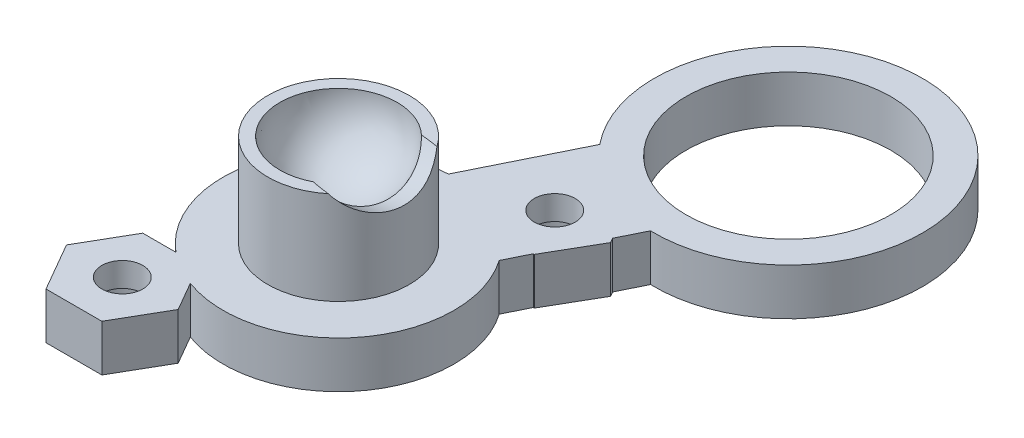
ISO-10303-21;
HEADER;
FILE_DESCRIPTION(('STEP AP214'),'2;1');
FILE_NAME('part.step','',(''),(''),'','','');
FILE_SCHEMA(('AUTOMOTIVE_DESIGN { 1 0 10303 214 1 1 1 1 }'));
ENDSEC;
DATA;
#1=APPLICATION_CONTEXT('core data for automotive mechanical design processes');
#2=APPLICATION_PROTOCOL_DEFINITION('international standard','automotive_design',2000,#1);
#3=PRODUCT_CONTEXT('',#1,'mechanical');
#4=PRODUCT('Part','Part','',(#3));
#5=PRODUCT_RELATED_PRODUCT_CATEGORY('part','',(#4));
#6=PRODUCT_DEFINITION_FORMATION('','',#4);
#7=PRODUCT_DEFINITION_CONTEXT('part definition',#1,'design');
#8=PRODUCT_DEFINITION('design','',#6,#7);
#9=PRODUCT_DEFINITION_SHAPE('','',#8);
#10=(LENGTH_UNIT() NAMED_UNIT(*) SI_UNIT(.MILLI.,.METRE.));
#11=(NAMED_UNIT(*) PLANE_ANGLE_UNIT() SI_UNIT($,.RADIAN.));
#12=(NAMED_UNIT(*) SI_UNIT($,.STERADIAN.) SOLID_ANGLE_UNIT());
#13=UNCERTAINTY_MEASURE_WITH_UNIT(LENGTH_MEASURE(1.E-05),#10,'distance_accuracy_value','');
#14=(GEOMETRIC_REPRESENTATION_CONTEXT(3) GLOBAL_UNCERTAINTY_ASSIGNED_CONTEXT((#13)) GLOBAL_UNIT_ASSIGNED_CONTEXT((#10,
#11,#12)) REPRESENTATION_CONTEXT('',''));
#15=CARTESIAN_POINT('',(0.,0.,0.));
#16=DIRECTION('',(0.,0.,1.));
#17=DIRECTION('',(1.,0.,0.));
#18=AXIS2_PLACEMENT_3D('',#15,#16,#17);
#19=CARTESIAN_POINT('',(-78.0224133595217,-108.75,-22.3612159321677));
#20=DIRECTION('',(0.,1.,0.));
#21=DIRECTION('',(0.,0.,1.));
#22=AXIS2_PLACEMENT_3D('',#19,#20,#21);
#23=CYLINDRICAL_SURFACE('',#22,1.1);
#24=CARTESIAN_POINT('',(-78.0224133595217,-106.,-22.3612159321677));
#25=DIRECTION('',(0.,-1.,0.));
#26=DIRECTION('',(0.,0.,-1.));
#27=AXIS2_PLACEMENT_3D('',#24,#25,#26);
#28=CIRCLE('',#27,1.1);
#29=CARTESIAN_POINT('',(-78.0224133595217,-106.,-23.4612159321677));
#30=VERTEX_POINT('',#29);
#31=EDGE_CURVE('E203',#30,#30,#28,.F.);
#32=ORIENTED_EDGE('',*,*,#31,.T.);
#33=EDGE_LOOP('',(#32));
#34=FACE_BOUND('',#33,.T.);
#35=CARTESIAN_POINT('',(-78.0224133595217,-107.3,-22.3612159321677));
#36=DIRECTION('',(0.,-1.,0.));
#37=DIRECTION('',(0.,0.,-1.));
#38=AXIS2_PLACEMENT_3D('',#35,#36,#37);
#39=CIRCLE('',#38,1.1);
#40=CARTESIAN_POINT('',(-78.0224133595217,-107.3,-23.4612159321677));
#41=VERTEX_POINT('',#40);
#42=EDGE_CURVE('E210',#41,#41,#39,.T.);
#43=ORIENTED_EDGE('',*,*,#42,.T.);
#44=EDGE_LOOP('',(#43));
#45=FACE_BOUND('',#44,.T.);
#46=ADVANCED_FACE('F41',(#34,#45),#23,.F.);
#47=CARTESIAN_POINT('',(-86.5224133595217,-108.75,-7.63878406783227));
#48=DIRECTION('',(0.,1.,0.));
#49=DIRECTION('',(0.,0.,1.));
#50=AXIS2_PLACEMENT_3D('',#47,#48,#49);
#51=CYLINDRICAL_SURFACE('',#50,1.1);
#52=CARTESIAN_POINT('',(-86.5224133595217,-106.,-7.63878406783227));
#53=DIRECTION('',(0.,-1.,0.));
#54=DIRECTION('',(0.,0.,-1.));
#55=AXIS2_PLACEMENT_3D('',#52,#53,#54);
#56=CIRCLE('',#55,1.1);
#57=CARTESIAN_POINT('',(-86.5224133595217,-106.,-8.73878406783227));
#58=VERTEX_POINT('',#57);
#59=EDGE_CURVE('E195',#58,#58,#56,.F.);
#60=ORIENTED_EDGE('',*,*,#59,.T.);
#61=EDGE_LOOP('',(#60));
#62=FACE_BOUND('',#61,.T.);
#63=CARTESIAN_POINT('',(-86.5224133595217,-107.3,-7.63878406783227));
#64=DIRECTION('',(0.,-1.,0.));
#65=DIRECTION('',(0.,0.,-1.));
#66=AXIS2_PLACEMENT_3D('',#63,#64,#65);
#67=CIRCLE('',#66,1.1);
#68=CARTESIAN_POINT('',(-86.5224133595217,-107.3,-8.73878406783227));
#69=VERTEX_POINT('',#68);
#70=EDGE_CURVE('E200',#69,#69,#67,.T.);
#71=ORIENTED_EDGE('',*,*,#70,.T.);
#72=EDGE_LOOP('',(#71));
#73=FACE_BOUND('',#72,.T.);
#74=ADVANCED_FACE('F348',(#62,#73),#51,.F.);
#75=CARTESIAN_POINT('',(-71.6012435520018,-108.5,-29.8496216370886));
#76=DIRECTION('',(-0.89680256466223,0.,-0.442430966383737));
#77=DIRECTION('',(-0.442430966383737,0.,0.89680256466223));
#78=AXIS2_PLACEMENT_3D('',#75,#76,#77);
#79=PLANE('',#78);
#80=DIRECTION('',(0.,1.,0.));
#81=VECTOR('',#80,1.);
#82=CARTESIAN_POINT('',(-74.49705477773,-108.5,-23.9798450361482));
#83=LINE('',#82,#81);
#84=CARTESIAN_POINT('',(-74.49705477773,-106.,-23.9798450361482));
#85=VERTEX_POINT('',#84);
#86=CARTESIAN_POINT('',(-74.49705477773,-108.5,-23.9798450361482));
#87=VERTEX_POINT('',#86);
#88=EDGE_CURVE('E241',#85,#87,#83,.F.);
#89=ORIENTED_EDGE('',*,*,#88,.F.);
#90=DIRECTION('',(-0.442430966383737,0.,0.89680256466223));
#91=VECTOR('',#90,1.);
#92=CARTESIAN_POINT('',(-71.6012435520018,-106.,-29.8496216370886));
#93=LINE('',#92,#91);
#94=CARTESIAN_POINT('',(-75.1697204578679,-106.,-22.6163593108189));
#95=VERTEX_POINT('',#94);
#96=EDGE_CURVE('E249',#85,#95,#93,.T.);
#97=ORIENTED_EDGE('',*,*,#96,.T.);
#98=DIRECTION('',(0.,-1.,0.));
#99=VECTOR('',#98,1.);
#100=CARTESIAN_POINT('',(-75.1697204578679,-108.5,-22.6163593108189));
#101=LINE('',#100,#99);
#102=CARTESIAN_POINT('',(-75.1697204578679,-108.5,-22.6163593108189));
#103=VERTEX_POINT('',#102);
#104=EDGE_CURVE('E184',#95,#103,#101,.T.);
#105=ORIENTED_EDGE('',*,*,#104,.T.);
#106=DIRECTION('',(-0.442430966383737,0.,0.89680256466223));
#107=VECTOR('',#106,1.);
#108=CARTESIAN_POINT('',(-71.6012435520018,-108.5,-29.8496216370886));
#109=LINE('',#108,#107);
#110=EDGE_CURVE('E63',#87,#103,#109,.T.);
#111=ORIENTED_EDGE('',*,*,#110,.F.);
#112=EDGE_LOOP('',(#89,#97,#105,#111));
#113=FACE_BOUND('',#112,.T.);
#114=ADVANCED_FACE('F354',(#113),#79,.F.);
#115=CARTESIAN_POINT('',(-84.9628210535084,-108.5,-16.3272928991512));
#116=DIRECTION('',(0.89680256466223,0.,0.442430966383737));
#117=DIRECTION('',(0.442430966383737,0.,-0.89680256466223));
#118=AXIS2_PLACEMENT_3D('',#115,#116,#117);
#119=PLANE('',#118);
#120=DIRECTION('',(0.,1.,0.));
#121=VECTOR('',#120,1.);
#122=CARTESIAN_POINT('',(-79.8778701657034,-108.5,-26.6344308344506));
#123=LINE('',#122,#121);
#124=CARTESIAN_POINT('',(-79.8778701657034,-108.5,-26.6344308344506));
#125=VERTEX_POINT('',#124);
#126=CARTESIAN_POINT('',(-79.8778701657034,-106.,-26.6344308344506));
#127=VERTEX_POINT('',#126);
#128=EDGE_CURVE('E49',#125,#127,#123,.T.);
#129=ORIENTED_EDGE('',*,*,#128,.F.);
#130=DIRECTION('',(0.442430966383737,0.,-0.89680256466223));
#131=VECTOR('',#130,1.);
#132=CARTESIAN_POINT('',(-84.9628210535084,-108.5,-16.3272928991512));
#133=LINE('',#132,#131);
#134=CARTESIAN_POINT('',(-82.5622508064944,-108.5,-21.193221637753));
#135=VERTEX_POINT('',#134);
#136=EDGE_CURVE('E246',#135,#125,#133,.T.);
#137=ORIENTED_EDGE('',*,*,#136,.F.);
#138=DIRECTION('',(0.,1.,0.));
#139=VECTOR('',#138,1.);
#140=CARTESIAN_POINT('',(-82.5622508064944,-108.5,-21.193221637753));
#141=LINE('',#140,#139);
#142=CARTESIAN_POINT('',(-82.5622508064944,-106.,-21.193221637753));
#143=VERTEX_POINT('',#142);
#144=EDGE_CURVE('E172',#135,#143,#141,.T.);
#145=ORIENTED_EDGE('',*,*,#144,.T.);
#146=DIRECTION('',(0.442430966383737,0.,-0.89680256466223));
#147=VECTOR('',#146,1.);
#148=CARTESIAN_POINT('',(-84.9628210535084,-106.,-16.3272928991512));
#149=LINE('',#148,#147);
#150=EDGE_CURVE('E244',#143,#127,#149,.T.);
#151=ORIENTED_EDGE('',*,*,#150,.T.);
#152=EDGE_LOOP('',(#129,#137,#145,#151));
#153=FACE_BOUND('',#152,.T.);
#154=ADVANCED_FACE('F378',(#153),#119,.F.);
#155=CARTESIAN_POINT('',(-82.2724133595217,-108.5,-15.));
#156=DIRECTION('',(0.,1.,0.));
#157=DIRECTION('',(0.,0.,1.));
#158=AXIS2_PLACEMENT_3D('',#155,#156,#157);
#159=CYLINDRICAL_SURFACE('',#158,6.2);
#160=DIRECTION('',(0.,1.,0.));
#161=VECTOR('',#160,1.);
#162=CARTESIAN_POINT('',(-77.181435418521,-108.5,-18.5386358394506));
#163=LINE('',#162,#161);
#164=CARTESIAN_POINT('',(-77.181435418521,-106.,-18.5386358394506));
#165=VERTEX_POINT('',#164);
#166=CARTESIAN_POINT('',(-77.181435418521,-108.5,-18.5386358394506));
#167=VERTEX_POINT('',#166);
#168=EDGE_CURVE('E177',#165,#167,#163,.F.);
#169=ORIENTED_EDGE('',*,*,#168,.F.);
#170=CARTESIAN_POINT('',(-82.2724133595217,-106.,-15.));
#171=DIRECTION('',(0.,-1.,0.));
#172=DIRECTION('',(0.,0.,-1.));
#173=AXIS2_PLACEMENT_3D('',#170,#171,#172);
#174=CIRCLE('',#173,6.2);
#175=CARTESIAN_POINT('',(-84.4129423972751,-106.,-9.18122560683656));
#176=VERTEX_POINT('',#175);
#177=EDGE_CURVE('E325',#165,#176,#174,.T.);
#178=ORIENTED_EDGE('',*,*,#177,.T.);
#179=DIRECTION('',(0.,1.,0.));
#180=VECTOR('',#179,1.);
#181=CARTESIAN_POINT('',(-84.4129423972751,-108.5,-9.18122560683656));
#182=LINE('',#181,#180);
#183=CARTESIAN_POINT('',(-84.4129423972751,-108.5,-9.18122560683656));
#184=VERTEX_POINT('',#183);
#185=EDGE_CURVE('E318',#184,#176,#182,.T.);
#186=ORIENTED_EDGE('',*,*,#185,.F.);
#187=CARTESIAN_POINT('',(-82.2724133595217,-108.5,-15.));
#188=DIRECTION('',(0.,-1.,0.));
#189=DIRECTION('',(0.,0.,-1.));
#190=AXIS2_PLACEMENT_3D('',#187,#188,#189);
#191=CIRCLE('',#190,6.2);
#192=EDGE_CURVE('E330',#167,#184,#191,.T.);
#193=ORIENTED_EDGE('',*,*,#192,.F.);
#194=EDGE_LOOP('',(#169,#178,#186,#193));
#195=FACE_BOUND('',#194,.T.);
#196=ADVANCED_FACE('F385',(#195),#159,.T.);
#197=ORIENTED_EDGE('',*,*,#144,.F.);
#198=CARTESIAN_POINT('',(-86.2413552840149,-108.5,-10.2368602791856));
#199=VERTEX_POINT('',#198);
#200=EDGE_CURVE('E323',#199,#135,#191,.T.);
#201=ORIENTED_EDGE('',*,*,#200,.F.);
#202=DIRECTION('',(0.,1.,0.));
#203=VECTOR('',#202,1.);
#204=CARTESIAN_POINT('',(-86.2413552840149,-108.5,-10.2368602791856));
#205=LINE('',#204,#203);
#206=CARTESIAN_POINT('',(-86.2413552840149,-106.,-10.2368602791856));
#207=VERTEX_POINT('',#206);
#208=EDGE_CURVE('E320',#207,#199,#205,.F.);
#209=ORIENTED_EDGE('',*,*,#208,.F.);
#210=EDGE_CURVE('E326',#207,#143,#174,.T.);
#211=ORIENTED_EDGE('',*,*,#210,.T.);
#212=EDGE_LOOP('',(#197,#201,#209,#211));
#213=FACE_BOUND('',#212,.T.);
#214=ADVANCED_FACE('F388',(#213),#159,.T.);
#215=CARTESIAN_POINT('',(-76.5224133595217,-108.5,-19.7631397208144));
#216=DIRECTION('',(0.,0.,-1.));
#217=DIRECTION('',(-1.,0.,0.));
#218=AXIS2_PLACEMENT_3D('',#215,#216,#217);
#219=PLANE('',#218);
#220=DIRECTION('',(0.,1.,0.));
#221=VECTOR('',#220,1.);
#222=CARTESIAN_POINT('',(-76.5773354115407,-108.5,-19.7631397208144));
#223=LINE('',#222,#221);
#224=CARTESIAN_POINT('',(-76.5773354115407,-108.5,-19.7631397208144));
#225=VERTEX_POINT('',#224);
#226=CARTESIAN_POINT('',(-76.5773354115407,-106.,-19.7631397208144));
#227=VERTEX_POINT('',#226);
#228=EDGE_CURVE('E255',#225,#227,#223,.T.);
#229=ORIENTED_EDGE('',*,*,#228,.F.);
#230=DIRECTION('',(-1.,0.,0.));
#231=VECTOR('',#230,1.);
#232=CARTESIAN_POINT('',(-76.5224133595217,-108.5,-19.7631397208144));
#233=LINE('',#232,#231);
#234=CARTESIAN_POINT('',(-76.5224133595217,-108.5,-19.7631397208144));
#235=VERTEX_POINT('',#234);
#236=EDGE_CURVE('E262',#235,#225,#233,.T.);
#237=ORIENTED_EDGE('',*,*,#236,.F.);
#238=DIRECTION('',(0.,1.,0.));
#239=VECTOR('',#238,1.);
#240=CARTESIAN_POINT('',(-76.5224133595217,-108.5,-19.7631397208144));
#241=LINE('',#240,#239);
#242=CARTESIAN_POINT('',(-76.5224133595217,-106.,-19.7631397208144));
#243=VERTEX_POINT('',#242);
#244=EDGE_CURVE('E270',#235,#243,#241,.T.);
#245=ORIENTED_EDGE('',*,*,#244,.T.);
#246=DIRECTION('',(-1.,0.,0.));
#247=VECTOR('',#246,1.);
#248=CARTESIAN_POINT('',(-76.5224133595217,-106.,-19.7631397208144));
#249=LINE('',#248,#247);
#250=EDGE_CURVE('E261',#243,#227,#249,.T.);
#251=ORIENTED_EDGE('',*,*,#250,.T.);
#252=EDGE_LOOP('',(#229,#237,#245,#251));
#253=FACE_BOUND('',#252,.T.);
#254=ADVANCED_FACE('F341',(#253),#219,.F.);
#255=CARTESIAN_POINT('',(-76.5224133595217,-108.5,-24.959292143521));
#256=DIRECTION('',(-0.86602540378444,0.,0.499999999999997));
#257=DIRECTION('',(0.499999999999997,0.,0.86602540378444));
#258=AXIS2_PLACEMENT_3D('',#255,#256,#257);
#259=PLANE('',#258);
#260=ORIENTED_EDGE('',*,*,#104,.F.);
#261=DIRECTION('',(0.499999999999997,0.,0.86602540378444));
#262=VECTOR('',#261,1.);
#263=CARTESIAN_POINT('',(-76.5224133595217,-106.,-24.959292143521));
#264=LINE('',#263,#262);
#265=CARTESIAN_POINT('',(-75.0224133595217,-106.,-22.3612159321677));
#266=VERTEX_POINT('',#265);
#267=EDGE_CURVE('E173',#95,#266,#264,.T.);
#268=ORIENTED_EDGE('',*,*,#267,.T.);
#269=DIRECTION('',(0.,1.,0.));
#270=VECTOR('',#269,1.);
#271=CARTESIAN_POINT('',(-75.0224133595217,-108.5,-22.3612159321677));
#272=LINE('',#271,#270);
#273=CARTESIAN_POINT('',(-75.0224133595217,-108.5,-22.3612159321677));
#274=VERTEX_POINT('',#273);
#275=EDGE_CURVE('E271',#274,#266,#272,.T.);
#276=ORIENTED_EDGE('',*,*,#275,.F.);
#277=DIRECTION('',(0.499999999999997,0.,0.86602540378444));
#278=VECTOR('',#277,1.);
#279=CARTESIAN_POINT('',(-76.5224133595217,-108.5,-24.959292143521));
#280=LINE('',#279,#278);
#281=EDGE_CURVE('E257',#103,#274,#280,.T.);
#282=ORIENTED_EDGE('',*,*,#281,.F.);
#283=EDGE_LOOP('',(#260,#268,#276,#282));
#284=FACE_BOUND('',#283,.T.);
#285=ADVANCED_FACE('F337',(#284),#259,.F.);
#286=CARTESIAN_POINT('',(-82.2724133595217,-106.02,-15.));
#287=DIRECTION('',(0.,1.,0.));
#288=DIRECTION('',(0.,0.,1.));
#289=AXIS2_PLACEMENT_3D('',#286,#287,#288);
#290=CYLINDRICAL_SURFACE('',#289,3.8);
#291=CARTESIAN_POINT('',(-82.2724133595217,-101.,-15.));
#292=DIRECTION('',(0.,-1.,0.));
#293=DIRECTION('',(0.,0.,-1.));
#294=AXIS2_PLACEMENT_3D('',#291,#292,#293);
#295=CIRCLE('',#294,3.8);
#296=CARTESIAN_POINT('',(-79.8758974920685,-101.,-12.0509812314864));
#297=VERTEX_POINT('',#296);
#298=CARTESIAN_POINT('',(-79.1484041425032,-101.,-17.1634616733336));
#299=VERTEX_POINT('',#298);
#300=EDGE_CURVE('E169',#297,#299,#295,.T.);
#301=ORIENTED_EDGE('',*,*,#300,.T.);
#302=CARTESIAN_POINT('',(-79.148511180301,-100.9998,-17.1636162262888));
#303=CARTESIAN_POINT('',(-79.1096706058397,-101.072342110152,-17.1075839958387));
#304=CARTESIAN_POINT('',(-79.0704940078615,-101.141737029236,-17.0477529523622));
#305=CARTESIAN_POINT('',(-78.9928844213158,-101.2741615165,-16.9209783391261));
#306=CARTESIAN_POINT('',(-78.9544514477714,-101.337190956191,-16.8540346258507));
#307=CARTESIAN_POINT('',(-78.8796991578984,-101.456886305187,-16.7134331246445));
#308=CARTESIAN_POINT('',(-78.8433825792021,-101.513544056817,-16.6397669435644));
#309=CARTESIAN_POINT('',(-78.7741584517933,-101.620336946865,-16.4863669304504));
#310=CARTESIAN_POINT('',(-78.7412503376675,-101.670473167461,-16.4066341086001));
#311=CARTESIAN_POINT('',(-78.6834994996304,-101.75869968596,-16.2512989185493));
#312=CARTESIAN_POINT('',(-78.6581640478375,-101.797512633648,-16.1762887878931));
#313=CARTESIAN_POINT('',(-78.6116903934059,-101.869875151759,-16.0225241549786));
#314=CARTESIAN_POINT('',(-78.5905517670075,-101.903425253509,-15.9437700317531));
#315=CARTESIAN_POINT('',(-78.5530886685602,-101.96510164616,-15.7832046686248));
#316=CARTESIAN_POINT('',(-78.5367565914317,-101.9932364806,-15.7013984914334));
#317=CARTESIAN_POINT('',(-78.5093551883445,-102.044024535532,-15.5352397983401));
#318=CARTESIAN_POINT('',(-78.4982856260354,-102.066678002182,-15.4508873969754));
#319=CARTESIAN_POINT('',(-78.4822131750876,-102.105385136737,-15.2846135128402));
#320=CARTESIAN_POINT('',(-78.4769336368466,-102.121713025434,-15.2027825673393));
#321=CARTESIAN_POINT('',(-78.471710135088,-102.149229670343,-15.0380589479656));
#322=CARTESIAN_POINT('',(-78.4717681362095,-102.160416532726,-14.9551658943775));
#323=CARTESIAN_POINT('',(-78.4773644569124,-102.17756924396,-14.789039755793));
#324=CARTESIAN_POINT('',(-78.4829013510981,-102.183536450003,-14.7058067648439));
#325=CARTESIAN_POINT('',(-78.4994724519996,-102.190221249505,-14.5396696065829));
#326=CARTESIAN_POINT('',(-78.5105086070254,-102.190936981028,-14.4567655663136));
#327=CARTESIAN_POINT('',(-78.5499904830626,-102.185424591192,-14.2203506199849));
#328=CARTESIAN_POINT('',(-78.5852326703067,-102.172629334172,-14.0680204194191));
#329=CARTESIAN_POINT('',(-78.6731837908015,-102.128913957544,-13.771371905283));
#330=CARTESIAN_POINT('',(-78.7258880157063,-102.09799872196,-13.627051444254));
#331=CARTESIAN_POINT('',(-78.8462400733784,-102.018550534102,-13.3494615049712));
#332=CARTESIAN_POINT('',(-78.9139300643192,-101.969967626041,-13.2162246918134));
#333=CARTESIAN_POINT('',(-79.0606200701408,-101.855858350757,-12.9638976081357));
#334=CARTESIAN_POINT('',(-79.1396294327997,-101.790317943255,-12.84481918013));
#335=CARTESIAN_POINT('',(-79.3100898808181,-101.638024621455,-12.6153846596886));
#336=CARTESIAN_POINT('',(-79.4020183806665,-101.550154500005,-12.5061281644802));
#337=CARTESIAN_POINT('',(-79.5876922550478,-101.356314064967,-12.3072847617699));
#338=CARTESIAN_POINT('',(-79.6814338569042,-101.250378363221,-12.2176609764649));
#339=CARTESIAN_POINT('',(-79.7900145651803,-101.113686188711,-12.1228062049506));
#340=CARTESIAN_POINT('',(-79.8074033360684,-101.091350519122,-12.1079005069893));
#341=CARTESIAN_POINT('',(-79.8419231429195,-101.046051944822,-12.0788321321466));
#342=CARTESIAN_POINT('',(-79.8590544230849,-101.023089701324,-12.0646687148022));
#343=CARTESIAN_POINT('',(-79.876043393218,-100.9998,-12.0508626711191));
#344=B_SPLINE_CURVE_WITH_KNOTS('',3,(#302,#303,#304,#305,#306,#307,#308,#309,#310,#311,#312,
#313,#314,#315,#316,#317,#318,#319,#320,#321,#322,#323,#324,#325,#326,#327,#328,#329,#330,#331,
#332,#333,#334,#335,#336,#337,#338,#339,#340,#341,#342,#343),.UNSPECIFIED.,.F.,.F.,(4,2,2,2,2,2,
2,2,2,2,2,2,2,2,2,2,2,2,2,2,4),(0.,0.298502367110116,0.597010758387174,0.895897080679048,
1.19473374252968,1.45893687456312,1.72311331603081,1.98686949351789,2.25061382405023,
2.50111827840571,2.75171493870103,3.00224642058704,3.252866725392,3.72104449842142,
4.18909613775275,4.65848162776414,5.12825700492776,5.62913773764794,6.12906939821766,
6.22503537633679,6.32090372644169),.UNSPECIFIED.);
#345=EDGE_CURVE('E167',#299,#297,#344,.T.);
#346=ORIENTED_EDGE('',*,*,#345,.T.);
#347=EDGE_LOOP('',(#301,#346));
#348=FACE_BOUND('',#347,.T.);
#349=CARTESIAN_POINT('',(-82.2724133595217,-106.,-15.));
#350=DIRECTION('',(0.,-1.,0.));
#351=DIRECTION('',(0.,0.,-1.));
#352=AXIS2_PLACEMENT_3D('',#349,#350,#351);
#353=CIRCLE('',#352,3.8);
#354=CARTESIAN_POINT('',(-82.2724133595217,-106.,-18.8));
#355=VERTEX_POINT('',#354);
#356=EDGE_CURVE('E182',#355,#355,#353,.T.);
#357=ORIENTED_EDGE('',*,*,#356,.F.);
#358=EDGE_LOOP('',(#357));
#359=FACE_BOUND('',#358,.T.);
#360=ADVANCED_FACE('F43',(#348,#359),#290,.T.);
#361=CARTESIAN_POINT('',(-82.2724133595217,-101.,-15.));
#362=DIRECTION('',(0.,-1.,0.));
#363=DIRECTION('',(0.,0.,-1.));
#364=AXIS2_PLACEMENT_3D('',#361,#362,#363);
#365=PLANE('',#364);
#366=ORIENTED_EDGE('',*,*,#300,.F.);
#367=CARTESIAN_POINT('',(-79.8256121020381,-101.,-14.6518262196257));
#368=DIRECTION('',(0.,-1.,0.));
#369=DIRECTION('',(0.990026908932881,0.,0.140878385811327));
#370=AXIS2_PLACEMENT_3D('',#367,#368,#369);
#371=ELLIPSE('',#370,5.40311255334571,2.58643522865266);
#372=CARTESIAN_POINT('',(-80.8278704568208,-101.,-12.2007508502713));
#373=VERTEX_POINT('',#372);
#374=EDGE_CURVE('E159',#297,#373,#371,.T.);
#375=ORIENTED_EDGE('',*,*,#374,.T.);
#376=CARTESIAN_POINT('',(-82.2724133595217,-101.,-15.));
#377=DIRECTION('',(0.,-1.,0.));
#378=DIRECTION('',(0.,0.,-1.));
#379=AXIS2_PLACEMENT_3D('',#376,#377,#378);
#380=CIRCLE('',#379,3.15);
#381=CARTESIAN_POINT('',(-80.104367780033,-101.,-17.285186724375));
#382=VERTEX_POINT('',#381);
#383=EDGE_CURVE('E170',#373,#382,#380,.T.);
#384=ORIENTED_EDGE('',*,*,#383,.T.);
#385=EDGE_CURVE('E60',#382,#299,#371,.T.);
#386=ORIENTED_EDGE('',*,*,#385,.T.);
#387=EDGE_LOOP('',(#366,#375,#384,#386));
#388=FACE_BOUND('',#387,.T.);
#389=ADVANCED_FACE('F168',(#388),#365,.F.);
#390=CARTESIAN_POINT('',(-82.2724133595217,-108.5,-15.));
#391=DIRECTION('',(0.,-1.,0.));
#392=DIRECTION('',(0.,0.,-1.));
#393=AXIS2_PLACEMENT_3D('',#390,#391,#392);
#394=PLANE('',#393);
#395=CARTESIAN_POINT('',(-78.0224133595217,-108.5,-22.3612159321677));
#396=DIRECTION('',(0.,-1.,0.));
#397=DIRECTION('',(0.,0.,-1.));
#398=AXIS2_PLACEMENT_3D('',#395,#396,#397);
#399=CIRCLE('',#398,2.1);
#400=CARTESIAN_POINT('',(-78.0224133595217,-108.5,-24.4612159321677));
#401=VERTEX_POINT('',#400);
#402=EDGE_CURVE('E207',#401,#401,#399,.F.);
#403=ORIENTED_EDGE('',*,*,#402,.T.);
#404=EDGE_LOOP('',(#403));
#405=FACE_BOUND('',#404,.T.);
#406=CARTESIAN_POINT('',(-86.5224133595217,-108.5,-7.63878406783227));
#407=DIRECTION('',(0.,-1.,0.));
#408=DIRECTION('',(0.,0.,-1.));
#409=AXIS2_PLACEMENT_3D('',#406,#407,#408);
#410=CIRCLE('',#409,2.1);
#411=CARTESIAN_POINT('',(-86.5224133595217,-108.5,-9.73878406783228));
#412=VERTEX_POINT('',#411);
#413=EDGE_CURVE('E198',#412,#412,#410,.F.);
#414=ORIENTED_EDGE('',*,*,#413,.T.);
#415=EDGE_LOOP('',(#414));
#416=FACE_BOUND('',#415,.T.);
#417=CARTESIAN_POINT('',(-74.2916512459885,-108.5,-31.1769145362398));
#418=DIRECTION('',(0.,-1.,0.));
#419=DIRECTION('',(0.,0.,-1.));
#420=AXIS2_PLACEMENT_3D('',#417,#418,#419);
#421=CIRCLE('',#420,5.50000000000001);
#422=CARTESIAN_POINT('',(-74.2916512459885,-108.5,-25.6769145362398));
#423=VERTEX_POINT('',#422);
#424=EDGE_CURVE('E191',#423,#423,#421,.F.);
#425=ORIENTED_EDGE('',*,*,#424,.T.);
#426=EDGE_LOOP('',(#425));
#427=FACE_BOUND('',#426,.T.);
#428=CARTESIAN_POINT('',(-74.2916512459885,-108.5,-31.1769145362398));
#429=DIRECTION('',(0.,-1.,0.));
#430=DIRECTION('',(0.,0.,-1.));
#431=AXIS2_PLACEMENT_3D('',#428,#429,#430);
#432=CIRCLE('',#431,7.2);
#433=EDGE_CURVE('E238',#125,#87,#432,.T.);
#434=ORIENTED_EDGE('',*,*,#433,.T.);
#435=ORIENTED_EDGE('',*,*,#110,.T.);
#436=ORIENTED_EDGE('',*,*,#281,.T.);
#437=DIRECTION('',(-0.499999999999997,0.,0.866025403784441));
#438=VECTOR('',#437,1.);
#439=CARTESIAN_POINT('',(-75.0224133595217,-108.5,-22.3612159321677));
#440=LINE('',#439,#438);
#441=EDGE_CURVE('E265',#274,#235,#440,.T.);
#442=ORIENTED_EDGE('',*,*,#441,.T.);
#443=ORIENTED_EDGE('',*,*,#236,.T.);
#444=EDGE_CURVE('E248',#225,#167,#109,.T.);
#445=ORIENTED_EDGE('',*,*,#444,.T.);
#446=ORIENTED_EDGE('',*,*,#192,.T.);
#447=DIRECTION('',(0.5,0.,0.866025403784438));
#448=VECTOR('',#447,1.);
#449=CARTESIAN_POINT('',(-85.0224133595217,-108.5,-10.2368602791856));
#450=LINE('',#449,#448);
#451=CARTESIAN_POINT('',(-83.5224133595217,-108.5,-7.63878406783227));
#452=VERTEX_POINT('',#451);
#453=EDGE_CURVE('E276',#184,#452,#450,.T.);
#454=ORIENTED_EDGE('',*,*,#453,.T.);
#455=DIRECTION('',(-0.5,0.,0.866025403784439));
#456=VECTOR('',#455,1.);
#457=CARTESIAN_POINT('',(-83.5224133595217,-108.5,-7.63878406783227));
#458=LINE('',#457,#456);
#459=CARTESIAN_POINT('',(-85.0224133595217,-108.5,-5.04070785647895));
#460=VERTEX_POINT('',#459);
#461=EDGE_CURVE('E278',#452,#460,#458,.T.);
#462=ORIENTED_EDGE('',*,*,#461,.T.);
#463=DIRECTION('',(-1.,0.,0.));
#464=VECTOR('',#463,1.);
#465=CARTESIAN_POINT('',(-85.0224133595217,-108.5,-5.04070785647895));
#466=LINE('',#465,#464);
#467=CARTESIAN_POINT('',(-88.0224133595217,-108.5,-5.04070785647895));
#468=VERTEX_POINT('',#467);
#469=EDGE_CURVE('E285',#460,#468,#466,.T.);
#470=ORIENTED_EDGE('',*,*,#469,.T.);
#471=DIRECTION('',(-0.5,0.,-0.866025403784439));
#472=VECTOR('',#471,1.);
#473=CARTESIAN_POINT('',(-88.0224133595217,-108.5,-5.04070785647895));
#474=LINE('',#473,#472);
#475=CARTESIAN_POINT('',(-89.5224133595217,-108.5,-7.63878406783227));
#476=VERTEX_POINT('',#475);
#477=EDGE_CURVE('E284',#468,#476,#474,.T.);
#478=ORIENTED_EDGE('',*,*,#477,.T.);
#479=DIRECTION('',(0.5,0.,-0.866025403784438));
#480=VECTOR('',#479,1.);
#481=CARTESIAN_POINT('',(-89.5224133595217,-108.5,-7.63878406783227));
#482=LINE('',#481,#480);
#483=CARTESIAN_POINT('',(-88.0224133595217,-108.5,-10.2368602791856));
#484=VERTEX_POINT('',#483);
#485=EDGE_CURVE('E287',#476,#484,#482,.T.);
#486=ORIENTED_EDGE('',*,*,#485,.T.);
#487=DIRECTION('',(1.,0.,0.));
#488=VECTOR('',#487,1.);
#489=CARTESIAN_POINT('',(-88.0224133595217,-108.5,-10.2368602791856));
#490=LINE('',#489,#488);
#491=EDGE_CURVE('E288',#484,#199,#490,.T.);
#492=ORIENTED_EDGE('',*,*,#491,.T.);
#493=ORIENTED_EDGE('',*,*,#200,.T.);
#494=ORIENTED_EDGE('',*,*,#136,.T.);
#495=EDGE_LOOP('',(#434,#435,#436,#442,#443,#445,#446,#454,#462,#470,#478,#486,#492,#493,#494));
#496=FACE_BOUND('',#495,.T.);
#497=ADVANCED_FACE('F215',(#405,#416,#427,#496),#394,.T.);
#498=CARTESIAN_POINT('',(-82.2724133595217,-106.,-15.));
#499=DIRECTION('',(0.,-1.,0.));
#500=DIRECTION('',(0.,0.,-1.));
#501=AXIS2_PLACEMENT_3D('',#498,#499,#500);
#502=PLANE('',#501);
#503=ORIENTED_EDGE('',*,*,#31,.F.);
#504=EDGE_LOOP('',(#503));
#505=FACE_BOUND('',#504,.T.);
#506=ORIENTED_EDGE('',*,*,#59,.F.);
#507=EDGE_LOOP('',(#506));
#508=FACE_BOUND('',#507,.T.);
#509=CARTESIAN_POINT('',(-74.2916512459885,-106.,-31.1769145362398));
#510=DIRECTION('',(0.,-1.,0.));
#511=DIRECTION('',(0.,0.,-1.));
#512=AXIS2_PLACEMENT_3D('',#509,#510,#511);
#513=CIRCLE('',#512,5.50000000000001);
#514=CARTESIAN_POINT('',(-74.2916512459885,-106.,-25.6769145362398));
#515=VERTEX_POINT('',#514);
#516=EDGE_CURVE('E186',#515,#515,#513,.F.);
#517=ORIENTED_EDGE('',*,*,#516,.F.);
#518=EDGE_LOOP('',(#517));
#519=FACE_BOUND('',#518,.T.);
#520=ORIENTED_EDGE('',*,*,#96,.F.);
#521=CARTESIAN_POINT('',(-74.2916512459885,-106.,-31.1769145362398));
#522=DIRECTION('',(0.,-1.,0.));
#523=DIRECTION('',(0.,0.,-1.));
#524=AXIS2_PLACEMENT_3D('',#521,#522,#523);
#525=CIRCLE('',#524,7.2);
#526=EDGE_CURVE('E240',#127,#85,#525,.T.);
#527=ORIENTED_EDGE('',*,*,#526,.F.);
#528=ORIENTED_EDGE('',*,*,#150,.F.);
#529=ORIENTED_EDGE('',*,*,#210,.F.);
#530=DIRECTION('',(1.,0.,0.));
#531=VECTOR('',#530,1.);
#532=CARTESIAN_POINT('',(-88.0224133595217,-106.,-10.2368602791856));
#533=LINE('',#532,#531);
#534=CARTESIAN_POINT('',(-88.0224133595217,-106.,-10.2368602791856));
#535=VERTEX_POINT('',#534);
#536=EDGE_CURVE('E277',#535,#207,#533,.T.);
#537=ORIENTED_EDGE('',*,*,#536,.F.);
#538=DIRECTION('',(0.5,0.,-0.866025403784438));
#539=VECTOR('',#538,1.);
#540=CARTESIAN_POINT('',(-89.5224133595217,-106.,-7.63878406783227));
#541=LINE('',#540,#539);
#542=CARTESIAN_POINT('',(-89.5224133595217,-106.,-7.63878406783227));
#543=VERTEX_POINT('',#542);
#544=EDGE_CURVE('E299',#543,#535,#541,.T.);
#545=ORIENTED_EDGE('',*,*,#544,.F.);
#546=DIRECTION('',(-0.5,0.,-0.866025403784439));
#547=VECTOR('',#546,1.);
#548=CARTESIAN_POINT('',(-88.0224133595217,-106.,-5.04070785647895));
#549=LINE('',#548,#547);
#550=CARTESIAN_POINT('',(-88.0224133595217,-106.,-5.04070785647895));
#551=VERTEX_POINT('',#550);
#552=EDGE_CURVE('E300',#551,#543,#549,.T.);
#553=ORIENTED_EDGE('',*,*,#552,.F.);
#554=DIRECTION('',(-1.,0.,0.));
#555=VECTOR('',#554,1.);
#556=CARTESIAN_POINT('',(-85.0224133595217,-106.,-5.04070785647895));
#557=LINE('',#556,#555);
#558=CARTESIAN_POINT('',(-85.0224133595217,-106.,-5.04070785647895));
#559=VERTEX_POINT('',#558);
#560=EDGE_CURVE('E294',#559,#551,#557,.T.);
#561=ORIENTED_EDGE('',*,*,#560,.F.);
#562=DIRECTION('',(-0.5,0.,0.866025403784439));
#563=VECTOR('',#562,1.);
#564=CARTESIAN_POINT('',(-83.5224133595217,-106.,-7.63878406783227));
#565=LINE('',#564,#563);
#566=CARTESIAN_POINT('',(-83.5224133595217,-106.,-7.63878406783227));
#567=VERTEX_POINT('',#566);
#568=EDGE_CURVE('E291',#567,#559,#565,.T.);
#569=ORIENTED_EDGE('',*,*,#568,.F.);
#570=DIRECTION('',(0.5,0.,0.866025403784438));
#571=VECTOR('',#570,1.);
#572=CARTESIAN_POINT('',(-85.0224133595217,-106.,-10.2368602791856));
#573=LINE('',#572,#571);
#574=EDGE_CURVE('E279',#176,#567,#573,.T.);
#575=ORIENTED_EDGE('',*,*,#574,.F.);
#576=ORIENTED_EDGE('',*,*,#177,.F.);
#577=EDGE_CURVE('E251',#227,#165,#93,.T.);
#578=ORIENTED_EDGE('',*,*,#577,.F.);
#579=ORIENTED_EDGE('',*,*,#250,.F.);
#580=DIRECTION('',(-0.499999999999997,0.,0.866025403784441));
#581=VECTOR('',#580,1.);
#582=CARTESIAN_POINT('',(-75.0224133595217,-106.,-22.3612159321677));
#583=LINE('',#582,#581);
#584=EDGE_CURVE('E176',#266,#243,#583,.T.);
#585=ORIENTED_EDGE('',*,*,#584,.F.);
#586=ORIENTED_EDGE('',*,*,#267,.F.);
#587=EDGE_LOOP('',(#520,#527,#528,#529,#537,#545,#553,#561,#569,#575,#576,#578,#579,#585,#586));
#588=FACE_BOUND('',#587,.T.);
#589=ORIENTED_EDGE('',*,*,#356,.T.);
#590=EDGE_LOOP('',(#589));
#591=FACE_BOUND('',#590,.T.);
#592=ADVANCED_FACE('F333',(#505,#508,#519,#588,#591),#502,.F.);
#593=CARTESIAN_POINT('',(-85.0224133595217,-108.5,-10.2368602791856));
#594=DIRECTION('',(-0.866025403784438,0.,0.5));
#595=DIRECTION('',(0.5,0.,0.866025403784438));
#596=AXIS2_PLACEMENT_3D('',#593,#594,#595);
#597=PLANE('',#596);
#598=ORIENTED_EDGE('',*,*,#453,.F.);
#599=ORIENTED_EDGE('',*,*,#185,.T.);
#600=ORIENTED_EDGE('',*,*,#574,.T.);
#601=DIRECTION('',(0.,1.,0.));
#602=VECTOR('',#601,1.);
#603=CARTESIAN_POINT('',(-83.5224133595217,-108.5,-7.63878406783227));
#604=LINE('',#603,#602);
#605=EDGE_CURVE('E313',#452,#567,#604,.T.);
#606=ORIENTED_EDGE('',*,*,#605,.F.);
#607=EDGE_LOOP('',(#598,#599,#600,#606));
#608=FACE_BOUND('',#607,.T.);
#609=ADVANCED_FACE('F399',(#608),#597,.F.);
#610=CARTESIAN_POINT('',(-88.0224133595217,-108.5,-10.2368602791856));
#611=DIRECTION('',(0.,0.,1.));
#612=DIRECTION('',(1.,0.,0.));
#613=AXIS2_PLACEMENT_3D('',#610,#611,#612);
#614=PLANE('',#613);
#615=ORIENTED_EDGE('',*,*,#536,.T.);
#616=ORIENTED_EDGE('',*,*,#208,.T.);
#617=ORIENTED_EDGE('',*,*,#491,.F.);
#618=DIRECTION('',(0.,1.,0.));
#619=VECTOR('',#618,1.);
#620=CARTESIAN_POINT('',(-88.0224133595217,-108.5,-10.2368602791856));
#621=LINE('',#620,#619);
#622=EDGE_CURVE('E293',#484,#535,#621,.T.);
#623=ORIENTED_EDGE('',*,*,#622,.T.);
#624=EDGE_LOOP('',(#615,#616,#617,#623));
#625=FACE_BOUND('',#624,.T.);
#626=ADVANCED_FACE('F392',(#625),#614,.F.);
#627=CARTESIAN_POINT('',(-83.5224133595217,-108.5,-7.63878406783227));
#628=DIRECTION('',(-0.866025403784438,0.,-0.5));
#629=DIRECTION('',(-0.5,0.,0.866025403784438));
#630=AXIS2_PLACEMENT_3D('',#627,#628,#629);
#631=PLANE('',#630);
#632=ORIENTED_EDGE('',*,*,#568,.T.);
#633=DIRECTION('',(0.,1.,0.));
#634=VECTOR('',#633,1.);
#635=CARTESIAN_POINT('',(-85.0224133595217,-108.5,-5.04070785647895));
#636=LINE('',#635,#634);
#637=EDGE_CURVE('E311',#460,#559,#636,.T.);
#638=ORIENTED_EDGE('',*,*,#637,.F.);
#639=ORIENTED_EDGE('',*,*,#461,.F.);
#640=ORIENTED_EDGE('',*,*,#605,.T.);
#641=EDGE_LOOP('',(#632,#638,#639,#640));
#642=FACE_BOUND('',#641,.T.);
#643=ADVANCED_FACE('F398',(#642),#631,.F.);
#644=CARTESIAN_POINT('',(-85.0224133595217,-108.5,-5.04070785647895));
#645=DIRECTION('',(0.,0.,-1.));
#646=DIRECTION('',(-1.,0.,0.));
#647=AXIS2_PLACEMENT_3D('',#644,#645,#646);
#648=PLANE('',#647);
#649=ORIENTED_EDGE('',*,*,#560,.T.);
#650=DIRECTION('',(0.,1.,0.));
#651=VECTOR('',#650,1.);
#652=CARTESIAN_POINT('',(-88.0224133595217,-108.5,-5.04070785647895));
#653=LINE('',#652,#651);
#654=EDGE_CURVE('E308',#468,#551,#653,.T.);
#655=ORIENTED_EDGE('',*,*,#654,.F.);
#656=ORIENTED_EDGE('',*,*,#469,.F.);
#657=ORIENTED_EDGE('',*,*,#637,.T.);
#658=EDGE_LOOP('',(#649,#655,#656,#657));
#659=FACE_BOUND('',#658,.T.);
#660=ADVANCED_FACE('F406',(#659),#648,.F.);
#661=CARTESIAN_POINT('',(-88.0224133595217,-108.5,-5.04070785647895));
#662=DIRECTION('',(0.866025403784438,0.,-0.5));
#663=DIRECTION('',(-0.5,0.,-0.866025403784438));
#664=AXIS2_PLACEMENT_3D('',#661,#662,#663);
#665=PLANE('',#664);
#666=ORIENTED_EDGE('',*,*,#552,.T.);
#667=DIRECTION('',(0.,1.,0.));
#668=VECTOR('',#667,1.);
#669=CARTESIAN_POINT('',(-89.5224133595217,-108.5,-7.63878406783227));
#670=LINE('',#669,#668);
#671=EDGE_CURVE('E304',#476,#543,#670,.T.);
#672=ORIENTED_EDGE('',*,*,#671,.F.);
#673=ORIENTED_EDGE('',*,*,#477,.F.);
#674=ORIENTED_EDGE('',*,*,#654,.T.);
#675=EDGE_LOOP('',(#666,#672,#673,#674));
#676=FACE_BOUND('',#675,.T.);
#677=ADVANCED_FACE('F401',(#676),#665,.F.);
#678=CARTESIAN_POINT('',(-89.5224133595217,-108.5,-7.63878406783227));
#679=DIRECTION('',(0.866025403784438,0.,0.5));
#680=DIRECTION('',(0.5,0.,-0.866025403784438));
#681=AXIS2_PLACEMENT_3D('',#678,#679,#680);
#682=PLANE('',#681);
#683=ORIENTED_EDGE('',*,*,#544,.T.);
#684=ORIENTED_EDGE('',*,*,#622,.F.);
#685=ORIENTED_EDGE('',*,*,#485,.F.);
#686=ORIENTED_EDGE('',*,*,#671,.T.);
#687=EDGE_LOOP('',(#683,#684,#685,#686));
#688=FACE_BOUND('',#687,.T.);
#689=ADVANCED_FACE('F395',(#688),#682,.F.);
#690=CARTESIAN_POINT('',(-75.0224133595217,-108.5,-22.3612159321677));
#691=DIRECTION('',(-0.866025403784441,0.,-0.499999999999997));
#692=DIRECTION('',(-0.499999999999997,0.,0.866025403784441));
#693=AXIS2_PLACEMENT_3D('',#690,#691,#692);
#694=PLANE('',#693);
#695=ORIENTED_EDGE('',*,*,#584,.T.);
#696=ORIENTED_EDGE('',*,*,#244,.F.);
#697=ORIENTED_EDGE('',*,*,#441,.F.);
#698=ORIENTED_EDGE('',*,*,#275,.T.);
#699=EDGE_LOOP('',(#695,#696,#697,#698));
#700=FACE_BOUND('',#699,.T.);
#701=ADVANCED_FACE('F389',(#700),#694,.F.);
#702=CARTESIAN_POINT('',(-82.2724133595217,-101.,-15.));
#703=DIRECTION('',(0.,0.,-1.));
#704=DIRECTION('',(-1.,0.,0.));
#705=AXIS2_PLACEMENT_3D('',#702,#703,#704);
#706=SPHERICAL_SURFACE('',#705,3.15);
#707=ORIENTED_EDGE('',*,*,#383,.F.);
#708=CARTESIAN_POINT('',(-80.9895402163871,-100.17230473673,-14.8174503177895));
#709=DIRECTION('',(-0.834342962059054,-0.538308656109163,-0.118724944390263));
#710=DIRECTION('',(0.542143136161945,-0.840286153588461,0.));
#711=AXIS2_PLACEMENT_3D('',#708,#709,#710);
#712=CIRCLE('',#711,2.74924219800812);
#713=EDGE_CURVE('E11',#373,#382,#712,.F.);
#714=ORIENTED_EDGE('',*,*,#713,.T.);
#715=EDGE_LOOP('',(#707,#714));
#716=FACE_BOUND('',#715,.T.);
#717=ADVANCED_FACE('F175',(#716),#706,.F.);
#718=ORIENTED_EDGE('',*,*,#577,.T.);
#719=ORIENTED_EDGE('',*,*,#168,.T.);
#720=ORIENTED_EDGE('',*,*,#444,.F.);
#721=ORIENTED_EDGE('',*,*,#228,.T.);
#722=EDGE_LOOP('',(#718,#719,#720,#721));
#723=FACE_BOUND('',#722,.T.);
#724=ADVANCED_FACE('F372',(#723),#79,.F.);
#725=CARTESIAN_POINT('',(-74.2916512459885,-108.5,-31.1769145362398));
#726=DIRECTION('',(0.,1.,0.));
#727=DIRECTION('',(0.,0.,1.));
#728=AXIS2_PLACEMENT_3D('',#725,#726,#727);
#729=CYLINDRICAL_SURFACE('',#728,7.2);
#730=ORIENTED_EDGE('',*,*,#526,.T.);
#731=ORIENTED_EDGE('',*,*,#88,.T.);
#732=ORIENTED_EDGE('',*,*,#433,.F.);
#733=ORIENTED_EDGE('',*,*,#128,.T.);
#734=EDGE_LOOP('',(#730,#731,#732,#733));
#735=FACE_BOUND('',#734,.T.);
#736=ADVANCED_FACE('F369',(#735),#729,.T.);
#737=CARTESIAN_POINT('',(-74.2916512459885,-108.6,-31.1769145362398));
#738=DIRECTION('',(0.,1.,0.));
#739=DIRECTION('',(0.,0.,1.));
#740=AXIS2_PLACEMENT_3D('',#737,#738,#739);
#741=CYLINDRICAL_SURFACE('',#740,5.50000000000001);
#742=CARTESIAN_POINT('',(-74.2916512459885,-108.5,-25.6769145362398));
#743=CARTESIAN_POINT('',(-74.2916512459885,-108.473958333333,-25.6769145362398));
#744=CARTESIAN_POINT('',(-74.2916512459885,-108.447916666667,-25.6769145362398));
#745=CARTESIAN_POINT('',(-74.2916512459885,-108.395833333333,-25.6769145362398));
#746=CARTESIAN_POINT('',(-74.2916512459885,-108.369791666667,-25.6769145362398));
#747=CARTESIAN_POINT('',(-74.2916512459885,-108.317708333333,-25.6769145362398));
#748=CARTESIAN_POINT('',(-74.2916512459885,-108.291666666667,-25.6769145362398));
#749=CARTESIAN_POINT('',(-74.2916512459885,-108.239583333333,-25.6769145362398));
#750=CARTESIAN_POINT('',(-74.2916512459885,-108.213541666667,-25.6769145362398));
#751=CARTESIAN_POINT('',(-74.2916512459885,-108.161458333333,-25.6769145362398));
#752=CARTESIAN_POINT('',(-74.2916512459885,-108.135416666667,-25.6769145362398));
#753=CARTESIAN_POINT('',(-74.2916512459885,-108.083333333333,-25.6769145362398));
#754=CARTESIAN_POINT('',(-74.2916512459885,-108.057291666667,-25.6769145362398));
#755=CARTESIAN_POINT('',(-74.2916512459885,-108.005208333333,-25.6769145362398));
#756=CARTESIAN_POINT('',(-74.2916512459885,-107.979166666667,-25.6769145362398));
#757=CARTESIAN_POINT('',(-74.2916512459885,-107.927083333333,-25.6769145362398));
#758=CARTESIAN_POINT('',(-74.2916512459885,-107.901041666667,-25.6769145362398));
#759=CARTESIAN_POINT('',(-74.2916512459885,-107.848958333333,-25.6769145362398));
#760=CARTESIAN_POINT('',(-74.2916512459885,-107.822916666667,-25.6769145362398));
#761=CARTESIAN_POINT('',(-74.2916512459885,-107.770833333333,-25.6769145362398));
#762=CARTESIAN_POINT('',(-74.2916512459885,-107.744791666667,-25.6769145362398));
#763=CARTESIAN_POINT('',(-74.2916512459885,-107.692708333333,-25.6769145362398));
#764=CARTESIAN_POINT('',(-74.2916512459885,-107.666666666667,-25.6769145362398));
#765=CARTESIAN_POINT('',(-74.2916512459885,-107.614583333333,-25.6769145362398));
#766=CARTESIAN_POINT('',(-74.2916512459885,-107.588541666667,-25.6769145362398));
#767=CARTESIAN_POINT('',(-74.2916512459885,-107.536458333333,-25.6769145362398));
#768=CARTESIAN_POINT('',(-74.2916512459885,-107.510416666667,-25.6769145362398));
#769=CARTESIAN_POINT('',(-74.2916512459885,-107.458333333333,-25.6769145362398));
#770=CARTESIAN_POINT('',(-74.2916512459885,-107.432291666667,-25.6769145362398));
#771=CARTESIAN_POINT('',(-74.2916512459885,-107.380208333333,-25.6769145362398));
#772=CARTESIAN_POINT('',(-74.2916512459885,-107.354166666667,-25.6769145362398));
#773=CARTESIAN_POINT('',(-74.2916512459885,-107.302083333333,-25.6769145362398));
#774=CARTESIAN_POINT('',(-74.2916512459885,-107.276041666667,-25.6769145362398));
#775=CARTESIAN_POINT('',(-74.2916512459885,-107.223958333333,-25.6769145362398));
#776=CARTESIAN_POINT('',(-74.2916512459885,-107.197916666667,-25.6769145362398));
#777=CARTESIAN_POINT('',(-74.2916512459885,-107.145833333333,-25.6769145362398));
#778=CARTESIAN_POINT('',(-74.2916512459885,-107.119791666667,-25.6769145362398));
#779=CARTESIAN_POINT('',(-74.2916512459885,-107.067708333333,-25.6769145362398));
#780=CARTESIAN_POINT('',(-74.2916512459885,-107.041666666667,-25.6769145362398));
#781=CARTESIAN_POINT('',(-74.2916512459885,-106.989583333333,-25.6769145362398));
#782=CARTESIAN_POINT('',(-74.2916512459885,-106.963541666667,-25.6769145362398));
#783=CARTESIAN_POINT('',(-74.2916512459885,-106.911458333333,-25.6769145362398));
#784=CARTESIAN_POINT('',(-74.2916512459885,-106.885416666667,-25.6769145362398));
#785=CARTESIAN_POINT('',(-74.2916512459885,-106.833333333333,-25.6769145362398));
#786=CARTESIAN_POINT('',(-74.2916512459885,-106.807291666667,-25.6769145362398));
#787=CARTESIAN_POINT('',(-74.2916512459885,-106.755208333333,-25.6769145362398));
#788=CARTESIAN_POINT('',(-74.2916512459885,-106.729166666667,-25.6769145362398));
#789=CARTESIAN_POINT('',(-74.2916512459885,-106.677083333333,-25.6769145362398));
#790=CARTESIAN_POINT('',(-74.2916512459885,-106.651041666667,-25.6769145362398));
#791=CARTESIAN_POINT('',(-74.2916512459885,-106.598958333333,-25.6769145362398));
#792=CARTESIAN_POINT('',(-74.2916512459885,-106.572916666667,-25.6769145362398));
#793=CARTESIAN_POINT('',(-74.2916512459885,-106.520833333333,-25.6769145362398));
#794=CARTESIAN_POINT('',(-74.2916512459885,-106.494791666667,-25.6769145362398));
#795=CARTESIAN_POINT('',(-74.2916512459885,-106.442708333333,-25.6769145362398));
#796=CARTESIAN_POINT('',(-74.2916512459885,-106.416666666667,-25.6769145362398));
#797=CARTESIAN_POINT('',(-74.2916512459885,-106.364583333333,-25.6769145362398));
#798=CARTESIAN_POINT('',(-74.2916512459885,-106.338541666667,-25.6769145362398));
#799=CARTESIAN_POINT('',(-74.2916512459885,-106.286458333333,-25.6769145362398));
#800=CARTESIAN_POINT('',(-74.2916512459885,-106.260416666667,-25.6769145362398));
#801=CARTESIAN_POINT('',(-74.2916512459885,-106.208333333333,-25.6769145362398));
#802=CARTESIAN_POINT('',(-74.2916512459885,-106.182291666667,-25.6769145362398));
#803=CARTESIAN_POINT('',(-74.2916512459885,-106.130208333333,-25.6769145362398));
#804=CARTESIAN_POINT('',(-74.2916512459885,-106.104166666667,-25.6769145362398));
#805=CARTESIAN_POINT('',(-74.2916512459885,-106.052083333333,-25.6769145362398));
#806=CARTESIAN_POINT('',(-74.2916512459885,-106.026041666667,-25.6769145362398));
#807=CARTESIAN_POINT('',(-74.2916512459885,-106.,-25.6769145362398));
#808=B_SPLINE_CURVE_WITH_KNOTS('',3,(#742,#743,#744,#745,#746,#747,#748,#749,#750,#751,#752,
#753,#754,#755,#756,#757,#758,#759,#760,#761,#762,#763,#764,#765,#766,#767,#768,#769,#770,#771,
#772,#773,#774,#775,#776,#777,#778,#779,#780,#781,#782,#783,#784,#785,#786,#787,#788,#789,#790,
#791,#792,#793,#794,#795,#796,#797,#798,#799,#800,#801,#802,#803,#804,#805,#806,#807),
.UNSPECIFIED.,.F.,.F.,(4,2,2,2,2,2,2,2,2,2,2,2,2,2,2,2,2,2,2,2,2,2,2,2,2,2,2,2,2,2,2,2,4),(0.,
0.0781250000000122,0.156250000000011,0.234375000000009,0.312500000000007,0.390625000000006,
0.468750000000004,0.546875000000002,0.625000000000001,0.703125000000013,0.781250000000011,
0.859375000000009,0.937500000000008,1.01562500000001,1.09375,1.171875,1.25,1.32812500000001,
1.40625000000001,1.48437500000001,1.56250000000001,1.64062500000001,1.71875,1.796875,1.875,
1.95312500000001,2.03125000000001,2.10937500000001,2.18750000000001,2.26562500000001,
2.34375000000001,2.421875,2.5),.UNSPECIFIED.);
#809=EDGE_CURVE('BSEAM362',#423,#515,#808,.T.);
#810=ORIENTED_EDGE('',*,*,#424,.F.);
#811=ORIENTED_EDGE('',*,*,#516,.T.);
#812=ORIENTED_EDGE('',*,*,#809,.T.);
#813=ORIENTED_EDGE('',*,*,#809,.F.);
#814=EDGE_LOOP('',(#810,#812,#811,#813));
#815=FACE_BOUND('',#814,.T.);
#816=ADVANCED_FACE('F362',(#815),#741,.F.);
#817=CARTESIAN_POINT('',(-86.5224133595217,-108.75,-7.63878406783227));
#818=DIRECTION('',(0.,1.,0.));
#819=DIRECTION('',(0.,0.,1.));
#820=AXIS2_PLACEMENT_3D('',#817,#818,#819);
#821=CYLINDRICAL_SURFACE('',#820,2.1);
#822=ORIENTED_EDGE('',*,*,#413,.F.);
#823=EDGE_LOOP('',(#822));
#824=FACE_BOUND('',#823,.T.);
#825=CARTESIAN_POINT('',(-86.5224133595217,-107.3,-7.63878406783227));
#826=DIRECTION('',(0.,-1.,0.));
#827=DIRECTION('',(0.,0.,-1.));
#828=AXIS2_PLACEMENT_3D('',#825,#826,#827);
#829=CIRCLE('',#828,2.1);
#830=CARTESIAN_POINT('',(-86.5224133595217,-107.3,-9.73878406783228));
#831=VERTEX_POINT('',#830);
#832=EDGE_CURVE('E197',#831,#831,#829,.T.);
#833=ORIENTED_EDGE('',*,*,#832,.F.);
#834=EDGE_LOOP('',(#833));
#835=FACE_BOUND('',#834,.T.);
#836=ADVANCED_FACE('F365',(#824,#835),#821,.F.);
#837=CARTESIAN_POINT('',(-86.5224133595217,-107.3,-7.63878406783227));
#838=DIRECTION('',(0.,-1.,0.));
#839=DIRECTION('',(0.,0.,-1.));
#840=AXIS2_PLACEMENT_3D('',#837,#838,#839);
#841=PLANE('',#840);
#842=ORIENTED_EDGE('',*,*,#70,.F.);
#843=EDGE_LOOP('',(#842));
#844=FACE_BOUND('',#843,.T.);
#845=ORIENTED_EDGE('',*,*,#832,.T.);
#846=EDGE_LOOP('',(#845));
#847=FACE_BOUND('',#846,.T.);
#848=ADVANCED_FACE('F217',(#844,#847),#841,.T.);
#849=CARTESIAN_POINT('',(-78.0224133595217,-108.75,-22.3612159321677));
#850=DIRECTION('',(0.,1.,0.));
#851=DIRECTION('',(0.,0.,1.));
#852=AXIS2_PLACEMENT_3D('',#849,#850,#851);
#853=CYLINDRICAL_SURFACE('',#852,2.1);
#854=ORIENTED_EDGE('',*,*,#402,.F.);
#855=EDGE_LOOP('',(#854));
#856=FACE_BOUND('',#855,.T.);
#857=CARTESIAN_POINT('',(-78.0224133595217,-107.3,-22.3612159321677));
#858=DIRECTION('',(0.,-1.,0.));
#859=DIRECTION('',(0.,0.,-1.));
#860=AXIS2_PLACEMENT_3D('',#857,#858,#859);
#861=CIRCLE('',#860,2.1);
#862=CARTESIAN_POINT('',(-78.0224133595217,-107.3,-24.4612159321677));
#863=VERTEX_POINT('',#862);
#864=EDGE_CURVE('E209',#863,#863,#861,.T.);
#865=ORIENTED_EDGE('',*,*,#864,.F.);
#866=EDGE_LOOP('',(#865));
#867=FACE_BOUND('',#866,.T.);
#868=ADVANCED_FACE('F218',(#856,#867),#853,.F.);
#869=CARTESIAN_POINT('',(-78.0224133595217,-107.3,-22.3612159321677));
#870=DIRECTION('',(0.,-1.,0.));
#871=DIRECTION('',(0.,0.,-1.));
#872=AXIS2_PLACEMENT_3D('',#869,#870,#871);
#873=PLANE('',#872);
#874=ORIENTED_EDGE('',*,*,#42,.F.);
#875=EDGE_LOOP('',(#874));
#876=FACE_BOUND('',#875,.T.);
#877=ORIENTED_EDGE('',*,*,#864,.T.);
#878=EDGE_LOOP('',(#877));
#879=FACE_BOUND('',#878,.T.);
#880=ADVANCED_FACE('F219',(#876,#879),#873,.T.);
#881=CARTESIAN_POINT('',(-82.2724133595217,-101.,-15.));
#882=DIRECTION('',(0.834342962059054,0.538308656109163,0.118724944390263));
#883=DIRECTION('',(-0.542143136161945,0.840286153588461,0.));
#884=AXIS2_PLACEMENT_3D('',#881,#882,#883);
#885=CONICAL_SURFACE('',#884,2.29999999999999,0.284261523704203);
#886=ORIENTED_EDGE('',*,*,#385,.F.);
#887=ORIENTED_EDGE('',*,*,#713,.F.);
#888=ORIENTED_EDGE('',*,*,#374,.F.);
#889=ORIENTED_EDGE('',*,*,#345,.F.);
#890=EDGE_LOOP('',(#886,#887,#888,#889));
#891=FACE_BOUND('',#890,.T.);
#892=ADVANCED_FACE('F158',(#891),#885,.F.);
#893=CLOSED_SHELL('',(#46,#74,#114,#154,#196,#214,#254,#285,#360,#389,#497,#592,#609,#626,#643,
#660,#677,#689,#701,#717,#724,#736,#816,#836,#848,#868,#880,#892));
#894=MANIFOLD_SOLID_BREP('B2',#893);
#895=ADVANCED_BREP_SHAPE_REPRESENTATION('',(#18,#894),#14);
#896=SHAPE_DEFINITION_REPRESENTATION(#9,#895);
ENDSEC;
END-ISO-10303-21;
